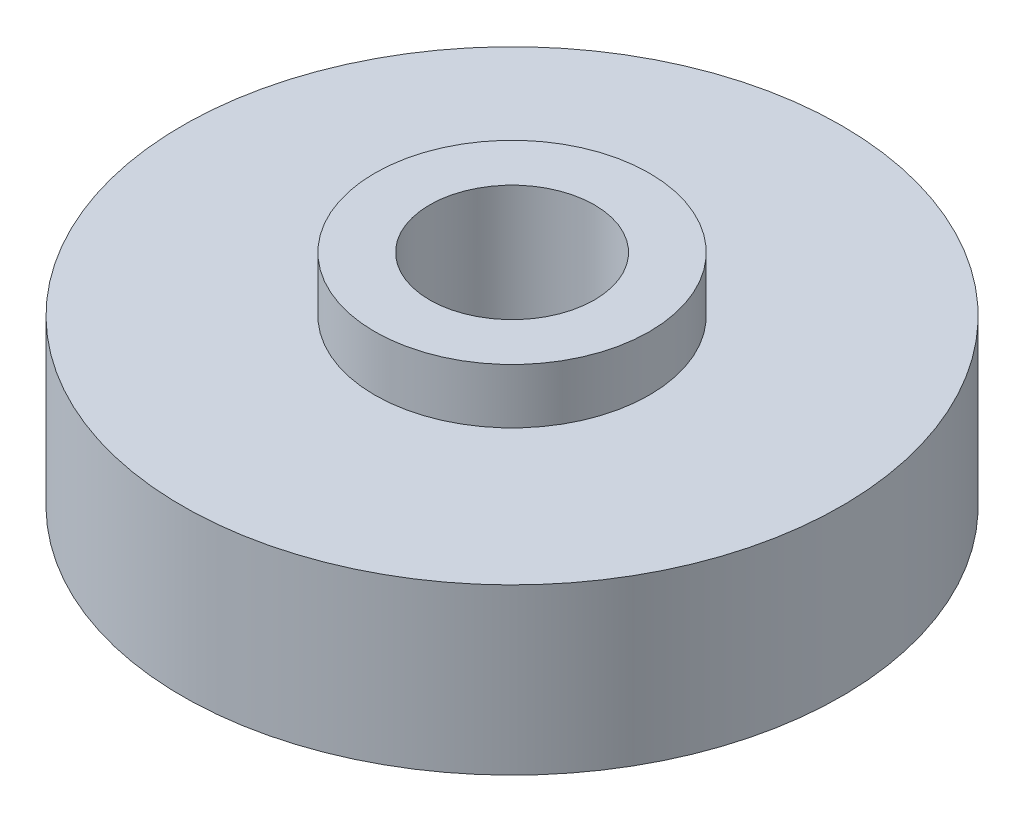
ISO-10303-21;
HEADER;
FILE_DESCRIPTION(('STEP AP214'),'2;1');
FILE_NAME('part.step','',(''),(''),'','','');
FILE_SCHEMA(('AUTOMOTIVE_DESIGN { 1 0 10303 214 1 1 1 1 }'));
ENDSEC;
DATA;
#1=APPLICATION_CONTEXT('core data for automotive mechanical design processes');
#2=APPLICATION_PROTOCOL_DEFINITION('international standard','automotive_design',2000,#1);
#3=PRODUCT_CONTEXT('',#1,'mechanical');
#4=PRODUCT('Part','Part','',(#3));
#5=PRODUCT_RELATED_PRODUCT_CATEGORY('part','',(#4));
#6=PRODUCT_DEFINITION_FORMATION('','',#4);
#7=PRODUCT_DEFINITION_CONTEXT('part definition',#1,'design');
#8=PRODUCT_DEFINITION('design','',#6,#7);
#9=PRODUCT_DEFINITION_SHAPE('','',#8);
#10=(LENGTH_UNIT() NAMED_UNIT(*) SI_UNIT(.MILLI.,.METRE.));
#11=(NAMED_UNIT(*) PLANE_ANGLE_UNIT() SI_UNIT($,.RADIAN.));
#12=(NAMED_UNIT(*) SI_UNIT($,.STERADIAN.) SOLID_ANGLE_UNIT());
#13=UNCERTAINTY_MEASURE_WITH_UNIT(LENGTH_MEASURE(1.E-05),#10,'distance_accuracy_value','');
#14=(GEOMETRIC_REPRESENTATION_CONTEXT(3) GLOBAL_UNCERTAINTY_ASSIGNED_CONTEXT((#13)) GLOBAL_UNIT_ASSIGNED_CONTEXT((#10,
#11,#12)) REPRESENTATION_CONTEXT('',''));
#15=CARTESIAN_POINT('',(0.,0.,0.));
#16=DIRECTION('',(0.,0.,1.));
#17=DIRECTION('',(1.,0.,0.));
#18=AXIS2_PLACEMENT_3D('',#15,#16,#17);
#19=CARTESIAN_POINT('',(0.,1.,0.));
#20=DIRECTION('',(0.,1.,0.));
#21=DIRECTION('',(0.,0.,1.));
#22=AXIS2_PLACEMENT_3D('',#19,#20,#21);
#23=PLANE('',#22);
#24=CARTESIAN_POINT('',(0.,1.,0.));
#25=DIRECTION('',(0.,1.,0.));
#26=DIRECTION('',(0.,0.,1.));
#27=AXIS2_PLACEMENT_3D('',#24,#25,#26);
#28=CIRCLE('',#27,2.5);
#29=CARTESIAN_POINT('',(0.,1.,2.5));
#30=VERTEX_POINT('',#29);
#31=EDGE_CURVE('E10',#30,#30,#28,.T.);
#32=ORIENTED_EDGE('',*,*,#31,.T.);
#33=EDGE_LOOP('',(#32));
#34=FACE_BOUND('',#33,.T.);
#35=CARTESIAN_POINT('',(0.,1.,0.));
#36=DIRECTION('',(0.,1.,0.));
#37=DIRECTION('',(0.,0.,1.));
#38=AXIS2_PLACEMENT_3D('',#35,#36,#37);
#39=CIRCLE('',#38,1.5);
#40=CARTESIAN_POINT('',(0.,1.,1.5));
#41=VERTEX_POINT('',#40);
#42=EDGE_CURVE('E50',#41,#41,#39,.T.);
#43=ORIENTED_EDGE('',*,*,#42,.F.);
#44=EDGE_LOOP('',(#43));
#45=FACE_BOUND('',#44,.T.);
#46=ADVANCED_FACE('F41',(#34,#45),#23,.T.);
#47=CARTESIAN_POINT('',(0.,1.,0.));
#48=DIRECTION('',(0.,-1.,0.));
#49=DIRECTION('',(0.,0.,-1.));
#50=AXIS2_PLACEMENT_3D('',#47,#48,#49);
#51=CYLINDRICAL_SURFACE('',#50,2.5);
#52=ORIENTED_EDGE('',*,*,#31,.F.);
#53=EDGE_LOOP('',(#52));
#54=FACE_BOUND('',#53,.T.);
#55=CARTESIAN_POINT('',(0.,0.,0.));
#56=DIRECTION('',(0.,1.,0.));
#57=DIRECTION('',(0.,0.,1.));
#58=AXIS2_PLACEMENT_3D('',#55,#56,#57);
#59=CIRCLE('',#58,2.5);
#60=CARTESIAN_POINT('',(0.,0.,2.5));
#61=VERTEX_POINT('',#60);
#62=EDGE_CURVE('E45',#61,#61,#59,.T.);
#63=ORIENTED_EDGE('',*,*,#62,.T.);
#64=EDGE_LOOP('',(#63));
#65=FACE_BOUND('',#64,.T.);
#66=ADVANCED_FACE('F43',(#54,#65),#51,.T.);
#67=CARTESIAN_POINT('',(0.,1.,0.));
#68=DIRECTION('',(0.,-1.,0.));
#69=DIRECTION('',(0.,0.,-1.));
#70=AXIS2_PLACEMENT_3D('',#67,#68,#69);
#71=CYLINDRICAL_SURFACE('',#70,1.5);
#72=ORIENTED_EDGE('',*,*,#42,.T.);
#73=EDGE_LOOP('',(#72));
#74=FACE_BOUND('',#73,.T.);
#75=CARTESIAN_POINT('',(0.,-3.,0.));
#76=DIRECTION('',(0.,-1.,0.));
#77=DIRECTION('',(0.,0.,-1.));
#78=AXIS2_PLACEMENT_3D('',#75,#76,#77);
#79=CIRCLE('',#78,1.5);
#80=CARTESIAN_POINT('',(0.,-3.,-1.5));
#81=VERTEX_POINT('',#80);
#82=EDGE_CURVE('E62',#81,#81,#79,.T.);
#83=ORIENTED_EDGE('',*,*,#82,.T.);
#84=EDGE_LOOP('',(#83));
#85=FACE_BOUND('',#84,.T.);
#86=ADVANCED_FACE('F70',(#74,#85),#71,.F.);
#87=CARTESIAN_POINT('',(0.,-3.,0.));
#88=DIRECTION('',(0.,-1.,0.));
#89=DIRECTION('',(0.,0.,-1.));
#90=AXIS2_PLACEMENT_3D('',#87,#88,#89);
#91=PLANE('',#90);
#92=CARTESIAN_POINT('',(0.,-3.,0.));
#93=DIRECTION('',(0.,-1.,0.));
#94=DIRECTION('',(0.,0.,-1.));
#95=AXIS2_PLACEMENT_3D('',#92,#93,#94);
#96=CIRCLE('',#95,6.);
#97=CARTESIAN_POINT('',(0.,-3.,-6.));
#98=VERTEX_POINT('',#97);
#99=EDGE_CURVE('E61',#98,#98,#96,.T.);
#100=ORIENTED_EDGE('',*,*,#99,.T.);
#101=EDGE_LOOP('',(#100));
#102=FACE_BOUND('',#101,.T.);
#103=ORIENTED_EDGE('',*,*,#82,.F.);
#104=EDGE_LOOP('',(#103));
#105=FACE_BOUND('',#104,.T.);
#106=ADVANCED_FACE('F72',(#102,#105),#91,.T.);
#107=CARTESIAN_POINT('',(0.,0.,0.));
#108=DIRECTION('',(0.,-1.,0.));
#109=DIRECTION('',(0.,0.,-1.));
#110=AXIS2_PLACEMENT_3D('',#107,#108,#109);
#111=PLANE('',#110);
#112=ORIENTED_EDGE('',*,*,#62,.F.);
#113=EDGE_LOOP('',(#112));
#114=FACE_BOUND('',#113,.T.);
#115=CARTESIAN_POINT('',(0.,0.,0.));
#116=DIRECTION('',(0.,-1.,0.));
#117=DIRECTION('',(0.,0.,-1.));
#118=AXIS2_PLACEMENT_3D('',#115,#116,#117);
#119=CIRCLE('',#118,6.);
#120=CARTESIAN_POINT('',(0.,0.,-6.));
#121=VERTEX_POINT('',#120);
#122=EDGE_CURVE('E57',#121,#121,#119,.T.);
#123=ORIENTED_EDGE('',*,*,#122,.F.);
#124=EDGE_LOOP('',(#123));
#125=FACE_BOUND('',#124,.T.);
#126=ADVANCED_FACE('F74',(#114,#125),#111,.F.);
#127=CARTESIAN_POINT('',(0.,-3.,0.));
#128=DIRECTION('',(0.,1.,0.));
#129=DIRECTION('',(0.,0.,1.));
#130=AXIS2_PLACEMENT_3D('',#127,#128,#129);
#131=CYLINDRICAL_SURFACE('',#130,6.);
#132=ORIENTED_EDGE('',*,*,#99,.F.);
#133=EDGE_LOOP('',(#132));
#134=FACE_BOUND('',#133,.T.);
#135=ORIENTED_EDGE('',*,*,#122,.T.);
#136=EDGE_LOOP('',(#135));
#137=FACE_BOUND('',#136,.T.);
#138=ADVANCED_FACE('F81',(#134,#137),#131,.T.);
#139=CLOSED_SHELL('',(#46,#66,#86,#106,#126,#138));
#140=MANIFOLD_SOLID_BREP('B2',#139);
#141=ADVANCED_BREP_SHAPE_REPRESENTATION('',(#18,#140),#14);
#142=SHAPE_DEFINITION_REPRESENTATION(#9,#141);
ENDSEC;
END-ISO-10303-21;
